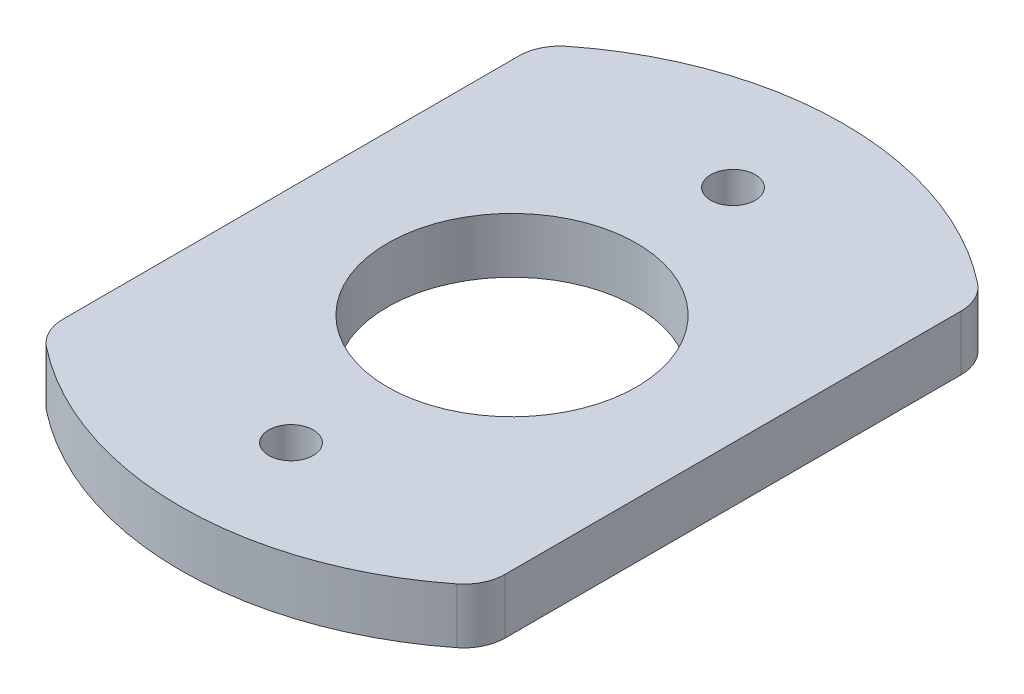
ISO-10303-21;
HEADER;
FILE_DESCRIPTION(('STEP AP214'),'2;1');
FILE_NAME('part.step','',(''),(''),'','','');
FILE_SCHEMA(('AUTOMOTIVE_DESIGN { 1 0 10303 214 1 1 1 1 }'));
ENDSEC;
DATA;
#1=APPLICATION_CONTEXT('core data for automotive mechanical design processes');
#2=APPLICATION_PROTOCOL_DEFINITION('international standard','automotive_design',2000,#1);
#3=PRODUCT_CONTEXT('',#1,'mechanical');
#4=PRODUCT('Part','Part','',(#3));
#5=PRODUCT_RELATED_PRODUCT_CATEGORY('part','',(#4));
#6=PRODUCT_DEFINITION_FORMATION('','',#4);
#7=PRODUCT_DEFINITION_CONTEXT('part definition',#1,'design');
#8=PRODUCT_DEFINITION('design','',#6,#7);
#9=PRODUCT_DEFINITION_SHAPE('','',#8);
#10=(LENGTH_UNIT() NAMED_UNIT(*) SI_UNIT(.MILLI.,.METRE.));
#11=(NAMED_UNIT(*) PLANE_ANGLE_UNIT() SI_UNIT($,.RADIAN.));
#12=(NAMED_UNIT(*) SI_UNIT($,.STERADIAN.) SOLID_ANGLE_UNIT());
#13=UNCERTAINTY_MEASURE_WITH_UNIT(LENGTH_MEASURE(1.E-05),#10,'distance_accuracy_value','');
#14=(GEOMETRIC_REPRESENTATION_CONTEXT(3) GLOBAL_UNCERTAINTY_ASSIGNED_CONTEXT((#13)) GLOBAL_UNIT_ASSIGNED_CONTEXT((#10,
#11,#12)) REPRESENTATION_CONTEXT('',''));
#15=CARTESIAN_POINT('',(0.,0.,0.));
#16=DIRECTION('',(0.,0.,1.));
#17=DIRECTION('',(1.,0.,0.));
#18=AXIS2_PLACEMENT_3D('',#15,#16,#17);
#19=CARTESIAN_POINT('',(0.,6.35,0.));
#20=DIRECTION('',(0.,1.,0.));
#21=DIRECTION('',(0.,0.,1.));
#22=AXIS2_PLACEMENT_3D('',#19,#20,#21);
#23=PLANE('',#22);
#24=CARTESIAN_POINT('',(0.,6.35,-25.4));
#25=DIRECTION('',(0.,1.,0.));
#26=DIRECTION('',(0.,0.,1.));
#27=AXIS2_PLACEMENT_3D('',#24,#25,#26);
#28=CIRCLE('',#27,2.55269999999998);
#29=CARTESIAN_POINT('',(0.,6.35,-22.8473));
#30=VERTEX_POINT('',#29);
#31=EDGE_CURVE('E338',#30,#30,#28,.T.);
#32=ORIENTED_EDGE('',*,*,#31,.F.);
#33=EDGE_LOOP('',(#32));
#34=FACE_BOUND('',#33,.T.);
#35=CARTESIAN_POINT('',(0.,6.35,25.4));
#36=DIRECTION('',(0.,1.,0.));
#37=DIRECTION('',(0.,0.,1.));
#38=AXIS2_PLACEMENT_3D('',#35,#36,#37);
#39=CIRCLE('',#38,2.55269999999998);
#40=CARTESIAN_POINT('',(0.,6.35,27.9527));
#41=VERTEX_POINT('',#40);
#42=EDGE_CURVE('E151',#41,#41,#39,.T.);
#43=ORIENTED_EDGE('',*,*,#42,.F.);
#44=EDGE_LOOP('',(#43));
#45=FACE_BOUND('',#44,.T.);
#46=CARTESIAN_POINT('',(0.,6.35,0.));
#47=DIRECTION('',(0.,1.,0.));
#48=DIRECTION('',(0.,0.,1.));
#49=AXIS2_PLACEMENT_3D('',#46,#47,#48);
#50=CIRCLE('',#49,14.3129);
#51=CARTESIAN_POINT('',(0.,6.35,14.3129));
#52=VERTEX_POINT('',#51);
#53=EDGE_CURVE('E131',#52,#52,#50,.T.);
#54=ORIENTED_EDGE('',*,*,#53,.F.);
#55=EDGE_LOOP('',(#54));
#56=FACE_BOUND('',#55,.T.);
#57=DIRECTION('',(0.,0.,1.));
#58=VECTOR('',#57,1.);
#59=CARTESIAN_POINT('',(-25.4,6.35,26.1817207226721));
#60=LINE('',#59,#58);
#61=CARTESIAN_POINT('',(-25.4,6.35,-26.1817207226721));
#62=VERTEX_POINT('',#61);
#63=CARTESIAN_POINT('',(-25.4,6.35,26.1817207226721));
#64=VERTEX_POINT('',#63);
#65=EDGE_CURVE('E117',#62,#64,#60,.T.);
#66=ORIENTED_EDGE('',*,*,#65,.T.);
#67=CARTESIAN_POINT('',(-20.6375,6.35,26.1817207226721));
#68=DIRECTION('',(0.,1.,0.));
#69=DIRECTION('',(0.,0.,-1.));
#70=AXIS2_PLACEMENT_3D('',#67,#68,#69);
#71=CIRCLE('',#70,4.7625);
#72=CARTESIAN_POINT('',(-23.5857142857143,6.35,29.9219665401967));
#73=VERTEX_POINT('',#72);
#74=EDGE_CURVE('E144',#64,#73,#71,.T.);
#75=ORIENTED_EDGE('',*,*,#74,.T.);
#76=CARTESIAN_POINT('',(0.,6.35,0.));
#77=DIRECTION('',(0.,1.,0.));
#78=DIRECTION('',(0.,0.,1.));
#79=AXIS2_PLACEMENT_3D('',#76,#77,#78);
#80=CIRCLE('',#79,38.1);
#81=CARTESIAN_POINT('',(23.5857142857143,6.35,29.9219665401967));
#82=VERTEX_POINT('',#81);
#83=EDGE_CURVE('E49',#73,#82,#80,.T.);
#84=ORIENTED_EDGE('',*,*,#83,.T.);
#85=CARTESIAN_POINT('',(20.6375,6.35,26.1817207226721));
#86=DIRECTION('',(0.,1.,0.));
#87=DIRECTION('',(0.,0.,-1.));
#88=AXIS2_PLACEMENT_3D('',#85,#86,#87);
#89=CIRCLE('',#88,4.7625);
#90=CARTESIAN_POINT('',(25.4,6.35,26.1817207226721));
#91=VERTEX_POINT('',#90);
#92=EDGE_CURVE('E64',#82,#91,#89,.T.);
#93=ORIENTED_EDGE('',*,*,#92,.T.);
#94=DIRECTION('',(0.,0.,-1.));
#95=VECTOR('',#94,1.);
#96=CARTESIAN_POINT('',(25.4,6.35,26.1817207226721));
#97=LINE('',#96,#95);
#98=CARTESIAN_POINT('',(25.4,6.35,-26.1817207226721));
#99=VERTEX_POINT('',#98);
#100=EDGE_CURVE('E148',#91,#99,#97,.T.);
#101=ORIENTED_EDGE('',*,*,#100,.T.);
#102=CARTESIAN_POINT('',(20.6375,6.35,-26.1817207226721));
#103=DIRECTION('',(0.,1.,0.));
#104=DIRECTION('',(0.,0.,1.));
#105=AXIS2_PLACEMENT_3D('',#102,#103,#104);
#106=CIRCLE('',#105,4.7625);
#107=CARTESIAN_POINT('',(23.5857142857143,6.35,-29.9219665401967));
#108=VERTEX_POINT('',#107);
#109=EDGE_CURVE('E157',#99,#108,#106,.T.);
#110=ORIENTED_EDGE('',*,*,#109,.T.);
#111=CARTESIAN_POINT('',(-23.5857142857143,6.35,-29.9219665401967));
#112=VERTEX_POINT('',#111);
#113=EDGE_CURVE('E12',#108,#112,#80,.T.);
#114=ORIENTED_EDGE('',*,*,#113,.T.);
#115=CARTESIAN_POINT('',(-20.6375,6.35,-26.1817207226721));
#116=DIRECTION('',(0.,1.,0.));
#117=DIRECTION('',(0.,0.,1.));
#118=AXIS2_PLACEMENT_3D('',#115,#116,#117);
#119=CIRCLE('',#118,4.7625);
#120=EDGE_CURVE('E56',#112,#62,#119,.T.);
#121=ORIENTED_EDGE('',*,*,#120,.T.);
#122=EDGE_LOOP('',(#66,#75,#84,#93,#101,#110,#114,#121));
#123=FACE_BOUND('',#122,.T.);
#124=ADVANCED_FACE('F40',(#34,#45,#56,#123),#23,.T.);
#125=CARTESIAN_POINT('',(0.,0.,0.));
#126=DIRECTION('',(0.,1.,0.));
#127=DIRECTION('',(0.,0.,1.));
#128=AXIS2_PLACEMENT_3D('',#125,#126,#127);
#129=PLANE('',#128);
#130=CARTESIAN_POINT('',(0.,0.,-25.4));
#131=DIRECTION('',(0.,1.,0.));
#132=DIRECTION('',(0.,0.,1.));
#133=AXIS2_PLACEMENT_3D('',#130,#131,#132);
#134=CIRCLE('',#133,2.55269999999998);
#135=CARTESIAN_POINT('',(0.,0.,-22.8473));
#136=VERTEX_POINT('',#135);
#137=EDGE_CURVE('E336',#136,#136,#134,.T.);
#138=ORIENTED_EDGE('',*,*,#137,.T.);
#139=EDGE_LOOP('',(#138));
#140=FACE_BOUND('',#139,.T.);
#141=CARTESIAN_POINT('',(0.,0.,25.4));
#142=DIRECTION('',(0.,1.,0.));
#143=DIRECTION('',(0.,0.,1.));
#144=AXIS2_PLACEMENT_3D('',#141,#142,#143);
#145=CIRCLE('',#144,2.55269999999998);
#146=CARTESIAN_POINT('',(0.,0.,27.9527));
#147=VERTEX_POINT('',#146);
#148=EDGE_CURVE('E146',#147,#147,#145,.T.);
#149=ORIENTED_EDGE('',*,*,#148,.T.);
#150=EDGE_LOOP('',(#149));
#151=FACE_BOUND('',#150,.T.);
#152=CARTESIAN_POINT('',(0.,0.,0.));
#153=DIRECTION('',(0.,1.,0.));
#154=DIRECTION('',(0.,0.,1.));
#155=AXIS2_PLACEMENT_3D('',#152,#153,#154);
#156=CIRCLE('',#155,14.3129);
#157=CARTESIAN_POINT('',(0.,0.,14.3129));
#158=VERTEX_POINT('',#157);
#159=EDGE_CURVE('E134',#158,#158,#156,.T.);
#160=ORIENTED_EDGE('',*,*,#159,.T.);
#161=EDGE_LOOP('',(#160));
#162=FACE_BOUND('',#161,.T.);
#163=CARTESIAN_POINT('',(-20.6375,0.,26.1817207226721));
#164=DIRECTION('',(0.,1.,0.));
#165=DIRECTION('',(0.,0.,-1.));
#166=AXIS2_PLACEMENT_3D('',#163,#164,#165);
#167=CIRCLE('',#166,4.7625);
#168=CARTESIAN_POINT('',(-25.4,0.,26.1817207226721));
#169=VERTEX_POINT('',#168);
#170=CARTESIAN_POINT('',(-23.5857142857143,0.,29.9219665401967));
#171=VERTEX_POINT('',#170);
#172=EDGE_CURVE('E105',#169,#171,#167,.T.);
#173=ORIENTED_EDGE('',*,*,#172,.F.);
#174=DIRECTION('',(0.,0.,1.));
#175=VECTOR('',#174,1.);
#176=CARTESIAN_POINT('',(-25.4,0.,26.1817207226721));
#177=LINE('',#176,#175);
#178=CARTESIAN_POINT('',(-25.4,0.,-26.1817207226721));
#179=VERTEX_POINT('',#178);
#180=EDGE_CURVE('E124',#179,#169,#177,.T.);
#181=ORIENTED_EDGE('',*,*,#180,.F.);
#182=CARTESIAN_POINT('',(-20.6375,0.,-26.1817207226721));
#183=DIRECTION('',(0.,1.,0.));
#184=DIRECTION('',(0.,0.,1.));
#185=AXIS2_PLACEMENT_3D('',#182,#183,#184);
#186=CIRCLE('',#185,4.7625);
#187=CARTESIAN_POINT('',(-23.5857142857143,0.,-29.9219665401967));
#188=VERTEX_POINT('',#187);
#189=EDGE_CURVE('E182',#188,#179,#186,.T.);
#190=ORIENTED_EDGE('',*,*,#189,.F.);
#191=CARTESIAN_POINT('',(0.,0.,0.));
#192=DIRECTION('',(0.,1.,0.));
#193=DIRECTION('',(0.,0.,1.));
#194=AXIS2_PLACEMENT_3D('',#191,#192,#193);
#195=CIRCLE('',#194,38.1);
#196=CARTESIAN_POINT('',(23.5857142857143,0.,-29.9219665401967));
#197=VERTEX_POINT('',#196);
#198=EDGE_CURVE('E130',#197,#188,#195,.T.);
#199=ORIENTED_EDGE('',*,*,#198,.F.);
#200=CARTESIAN_POINT('',(20.6375,0.,-26.1817207226721));
#201=DIRECTION('',(0.,1.,0.));
#202=DIRECTION('',(0.,0.,1.));
#203=AXIS2_PLACEMENT_3D('',#200,#201,#202);
#204=CIRCLE('',#203,4.7625);
#205=CARTESIAN_POINT('',(25.4,0.,-26.1817207226721));
#206=VERTEX_POINT('',#205);
#207=EDGE_CURVE('E179',#206,#197,#204,.T.);
#208=ORIENTED_EDGE('',*,*,#207,.F.);
#209=DIRECTION('',(0.,0.,-1.));
#210=VECTOR('',#209,1.);
#211=CARTESIAN_POINT('',(25.4,0.,26.1817207226721));
#212=LINE('',#211,#210);
#213=CARTESIAN_POINT('',(25.4,0.,26.1817207226721));
#214=VERTEX_POINT('',#213);
#215=EDGE_CURVE('E174',#214,#206,#212,.T.);
#216=ORIENTED_EDGE('',*,*,#215,.F.);
#217=CARTESIAN_POINT('',(20.6375,0.,26.1817207226721));
#218=DIRECTION('',(0.,1.,0.));
#219=DIRECTION('',(0.,0.,-1.));
#220=AXIS2_PLACEMENT_3D('',#217,#218,#219);
#221=CIRCLE('',#220,4.7625);
#222=CARTESIAN_POINT('',(23.5857142857143,0.,29.9219665401967));
#223=VERTEX_POINT('',#222);
#224=EDGE_CURVE('E116',#223,#214,#221,.T.);
#225=ORIENTED_EDGE('',*,*,#224,.F.);
#226=EDGE_CURVE('E44',#171,#223,#195,.T.);
#227=ORIENTED_EDGE('',*,*,#226,.F.);
#228=EDGE_LOOP('',(#173,#181,#190,#199,#208,#216,#225,#227));
#229=FACE_BOUND('',#228,.T.);
#230=ADVANCED_FACE('F127',(#140,#151,#162,#229),#129,.F.);
#231=CARTESIAN_POINT('',(0.,6.35,0.));
#232=DIRECTION('',(0.,-1.,0.));
#233=DIRECTION('',(0.,0.,-1.));
#234=AXIS2_PLACEMENT_3D('',#231,#232,#233);
#235=CYLINDRICAL_SURFACE('',#234,38.1);
#236=DIRECTION('',(0.,1.,0.));
#237=VECTOR('',#236,1.);
#238=CARTESIAN_POINT('',(-23.5857142857143,0.,29.9219665401967));
#239=LINE('',#238,#237);
#240=EDGE_CURVE('E109',#171,#73,#239,.T.);
#241=ORIENTED_EDGE('',*,*,#240,.F.);
#242=ORIENTED_EDGE('',*,*,#226,.T.);
#243=DIRECTION('',(0.,1.,0.));
#244=VECTOR('',#243,1.);
#245=CARTESIAN_POINT('',(23.5857142857143,0.,29.9219665401967));
#246=LINE('',#245,#244);
#247=EDGE_CURVE('E123',#223,#82,#246,.T.);
#248=ORIENTED_EDGE('',*,*,#247,.T.);
#249=ORIENTED_EDGE('',*,*,#83,.F.);
#250=EDGE_LOOP('',(#241,#242,#248,#249));
#251=FACE_BOUND('',#250,.T.);
#252=ADVANCED_FACE('F42',(#251),#235,.T.);
#253=ORIENTED_EDGE('',*,*,#198,.T.);
#254=DIRECTION('',(0.,1.,0.));
#255=VECTOR('',#254,1.);
#256=CARTESIAN_POINT('',(-23.5857142857143,0.,-29.9219665401967));
#257=LINE('',#256,#255);
#258=EDGE_CURVE('E165',#188,#112,#257,.T.);
#259=ORIENTED_EDGE('',*,*,#258,.T.);
#260=ORIENTED_EDGE('',*,*,#113,.F.);
#261=DIRECTION('',(0.,1.,0.));
#262=VECTOR('',#261,1.);
#263=CARTESIAN_POINT('',(23.5857142857143,0.,-29.9219665401967));
#264=LINE('',#263,#262);
#265=EDGE_CURVE('E167',#197,#108,#264,.T.);
#266=ORIENTED_EDGE('',*,*,#265,.F.);
#267=EDGE_LOOP('',(#253,#259,#260,#266));
#268=FACE_BOUND('',#267,.T.);
#269=ADVANCED_FACE('F190',(#268),#235,.T.);
#270=CARTESIAN_POINT('',(0.,6.35,0.));
#271=DIRECTION('',(0.,-1.,0.));
#272=DIRECTION('',(0.,0.,-1.));
#273=AXIS2_PLACEMENT_3D('',#270,#271,#272);
#274=CYLINDRICAL_SURFACE('',#273,14.3129);
#275=ORIENTED_EDGE('',*,*,#53,.T.);
#276=EDGE_LOOP('',(#275));
#277=FACE_BOUND('',#276,.T.);
#278=ORIENTED_EDGE('',*,*,#159,.F.);
#279=EDGE_LOOP('',(#278));
#280=FACE_BOUND('',#279,.T.);
#281=ADVANCED_FACE('F215',(#277,#280),#274,.F.);
#282=CARTESIAN_POINT('',(20.6375,0.,26.1817207226721));
#283=DIRECTION('',(0.,1.,0.));
#284=DIRECTION('',(0.,0.,1.));
#285=AXIS2_PLACEMENT_3D('',#282,#283,#284);
#286=CYLINDRICAL_SURFACE('',#285,4.7625);
#287=ORIENTED_EDGE('',*,*,#92,.F.);
#288=ORIENTED_EDGE('',*,*,#247,.F.);
#289=ORIENTED_EDGE('',*,*,#224,.T.);
#290=DIRECTION('',(0.,1.,0.));
#291=VECTOR('',#290,1.);
#292=CARTESIAN_POINT('',(25.4,0.,26.1817207226721));
#293=LINE('',#292,#291);
#294=EDGE_CURVE('E171',#214,#91,#293,.T.);
#295=ORIENTED_EDGE('',*,*,#294,.T.);
#296=EDGE_LOOP('',(#287,#288,#289,#295));
#297=FACE_BOUND('',#296,.T.);
#298=ADVANCED_FACE('F172',(#297),#286,.T.);
#299=CARTESIAN_POINT('',(20.6375,0.,-26.1817207226721));
#300=DIRECTION('',(0.,1.,0.));
#301=DIRECTION('',(0.,0.,1.));
#302=AXIS2_PLACEMENT_3D('',#299,#300,#301);
#303=CYLINDRICAL_SURFACE('',#302,4.7625);
#304=ORIENTED_EDGE('',*,*,#109,.F.);
#305=DIRECTION('',(0.,1.,0.));
#306=VECTOR('',#305,1.);
#307=CARTESIAN_POINT('',(25.4,0.,-26.1817207226721));
#308=LINE('',#307,#306);
#309=EDGE_CURVE('E169',#206,#99,#308,.T.);
#310=ORIENTED_EDGE('',*,*,#309,.F.);
#311=ORIENTED_EDGE('',*,*,#207,.T.);
#312=ORIENTED_EDGE('',*,*,#265,.T.);
#313=EDGE_LOOP('',(#304,#310,#311,#312));
#314=FACE_BOUND('',#313,.T.);
#315=ADVANCED_FACE('F194',(#314),#303,.T.);
#316=CARTESIAN_POINT('',(25.4,0.,26.1817207226721));
#317=DIRECTION('',(1.,0.,0.));
#318=DIRECTION('',(0.,0.,-1.));
#319=AXIS2_PLACEMENT_3D('',#316,#317,#318);
#320=PLANE('',#319);
#321=ORIENTED_EDGE('',*,*,#100,.F.);
#322=ORIENTED_EDGE('',*,*,#294,.F.);
#323=ORIENTED_EDGE('',*,*,#215,.T.);
#324=ORIENTED_EDGE('',*,*,#309,.T.);
#325=EDGE_LOOP('',(#321,#322,#323,#324));
#326=FACE_BOUND('',#325,.T.);
#327=ADVANCED_FACE('F195',(#326),#320,.T.);
#328=CARTESIAN_POINT('',(-20.6375,0.,26.1817207226721));
#329=DIRECTION('',(0.,1.,0.));
#330=DIRECTION('',(0.,0.,1.));
#331=AXIS2_PLACEMENT_3D('',#328,#329,#330);
#332=CYLINDRICAL_SURFACE('',#331,4.7625);
#333=ORIENTED_EDGE('',*,*,#74,.F.);
#334=DIRECTION('',(0.,1.,0.));
#335=VECTOR('',#334,1.);
#336=CARTESIAN_POINT('',(-25.4,0.,26.1817207226721));
#337=LINE('',#336,#335);
#338=EDGE_CURVE('E111',#169,#64,#337,.T.);
#339=ORIENTED_EDGE('',*,*,#338,.F.);
#340=ORIENTED_EDGE('',*,*,#172,.T.);
#341=ORIENTED_EDGE('',*,*,#240,.T.);
#342=EDGE_LOOP('',(#333,#339,#340,#341));
#343=FACE_BOUND('',#342,.T.);
#344=ADVANCED_FACE('F108',(#343),#332,.T.);
#345=CARTESIAN_POINT('',(-25.4,0.,26.1817207226721));
#346=DIRECTION('',(-1.,0.,0.));
#347=DIRECTION('',(0.,0.,1.));
#348=AXIS2_PLACEMENT_3D('',#345,#346,#347);
#349=PLANE('',#348);
#350=ORIENTED_EDGE('',*,*,#65,.F.);
#351=DIRECTION('',(0.,1.,0.));
#352=VECTOR('',#351,1.);
#353=CARTESIAN_POINT('',(-25.4,0.,-26.1817207226721));
#354=LINE('',#353,#352);
#355=EDGE_CURVE('E163',#179,#62,#354,.T.);
#356=ORIENTED_EDGE('',*,*,#355,.F.);
#357=ORIENTED_EDGE('',*,*,#180,.T.);
#358=ORIENTED_EDGE('',*,*,#338,.T.);
#359=EDGE_LOOP('',(#350,#356,#357,#358));
#360=FACE_BOUND('',#359,.T.);
#361=ADVANCED_FACE('F187',(#360),#349,.T.);
#362=CARTESIAN_POINT('',(-20.6375,0.,-26.1817207226721));
#363=DIRECTION('',(0.,1.,0.));
#364=DIRECTION('',(0.,0.,1.));
#365=AXIS2_PLACEMENT_3D('',#362,#363,#364);
#366=CYLINDRICAL_SURFACE('',#365,4.7625);
#367=ORIENTED_EDGE('',*,*,#120,.F.);
#368=ORIENTED_EDGE('',*,*,#258,.F.);
#369=ORIENTED_EDGE('',*,*,#189,.T.);
#370=ORIENTED_EDGE('',*,*,#355,.T.);
#371=EDGE_LOOP('',(#367,#368,#369,#370));
#372=FACE_BOUND('',#371,.T.);
#373=ADVANCED_FACE('F250',(#372),#366,.T.);
#374=CARTESIAN_POINT('',(0.,6.35,25.4));
#375=DIRECTION('',(0.,1.,0.));
#376=DIRECTION('',(0.,0.,1.));
#377=AXIS2_PLACEMENT_3D('',#374,#375,#376);
#378=CYLINDRICAL_SURFACE('',#377,2.55269999999998);
#379=ORIENTED_EDGE('',*,*,#148,.F.);
#380=EDGE_LOOP('',(#379));
#381=FACE_BOUND('',#380,.T.);
#382=ORIENTED_EDGE('',*,*,#42,.T.);
#383=EDGE_LOOP('',(#382));
#384=FACE_BOUND('',#383,.T.);
#385=ADVANCED_FACE('F259',(#381,#384),#378,.F.);
#386=CARTESIAN_POINT('',(0.,6.35,-25.4));
#387=DIRECTION('',(0.,1.,0.));
#388=DIRECTION('',(0.,0.,1.));
#389=AXIS2_PLACEMENT_3D('',#386,#387,#388);
#390=CYLINDRICAL_SURFACE('',#389,2.55269999999998);
#391=ORIENTED_EDGE('',*,*,#137,.F.);
#392=EDGE_LOOP('',(#391));
#393=FACE_BOUND('',#392,.T.);
#394=ORIENTED_EDGE('',*,*,#31,.T.);
#395=EDGE_LOOP('',(#394));
#396=FACE_BOUND('',#395,.T.);
#397=ADVANCED_FACE('F284',(#393,#396),#390,.F.);
#398=CLOSED_SHELL('',(#124,#230,#252,#269,#281,#298,#315,#327,#344,#361,#373,#385,#397));
#399=MANIFOLD_SOLID_BREP('B2',#398);
#400=ADVANCED_BREP_SHAPE_REPRESENTATION('',(#18,#399),#14);
#401=SHAPE_DEFINITION_REPRESENTATION(#9,#400);
ENDSEC;
END-ISO-10303-21;
